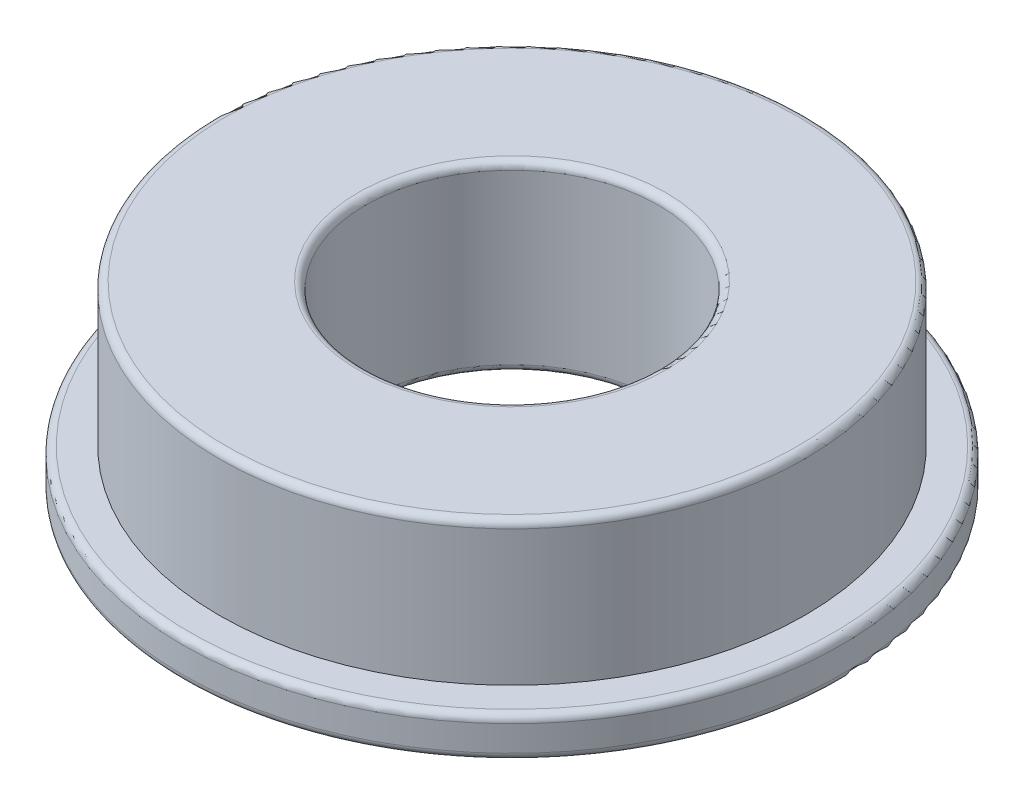
ISO-10303-21;
HEADER;
FILE_DESCRIPTION(('STEP AP214'),'2;1');
FILE_NAME('part.step','',(''),(''),'','','');
FILE_SCHEMA(('AUTOMOTIVE_DESIGN { 1 0 10303 214 1 1 1 1 }'));
ENDSEC;
DATA;
#1=APPLICATION_CONTEXT('core data for automotive mechanical design processes');
#2=APPLICATION_PROTOCOL_DEFINITION('international standard','automotive_design',2000,#1);
#3=PRODUCT_CONTEXT('',#1,'mechanical');
#4=PRODUCT('Part','Part','',(#3));
#5=PRODUCT_RELATED_PRODUCT_CATEGORY('part','',(#4));
#6=PRODUCT_DEFINITION_FORMATION('','',#4);
#7=PRODUCT_DEFINITION_CONTEXT('part definition',#1,'design');
#8=PRODUCT_DEFINITION('design','',#6,#7);
#9=PRODUCT_DEFINITION_SHAPE('','',#8);
#10=(LENGTH_UNIT() NAMED_UNIT(*) SI_UNIT(.MILLI.,.METRE.));
#11=(NAMED_UNIT(*) PLANE_ANGLE_UNIT() SI_UNIT($,.RADIAN.));
#12=(NAMED_UNIT(*) SI_UNIT($,.STERADIAN.) SOLID_ANGLE_UNIT());
#13=UNCERTAINTY_MEASURE_WITH_UNIT(LENGTH_MEASURE(1.E-05),#10,'distance_accuracy_value','');
#14=(GEOMETRIC_REPRESENTATION_CONTEXT(3) GLOBAL_UNCERTAINTY_ASSIGNED_CONTEXT((#13)) GLOBAL_UNIT_ASSIGNED_CONTEXT((#10,
#11,#12)) REPRESENTATION_CONTEXT('',''));
#15=CARTESIAN_POINT('',(0.,0.,0.));
#16=DIRECTION('',(0.,0.,1.));
#17=DIRECTION('',(1.,0.,0.));
#18=AXIS2_PLACEMENT_3D('',#15,#16,#17);
#19=CARTESIAN_POINT('',(0.,5.,0.));
#20=DIRECTION('',(0.,-1.,0.));
#21=DIRECTION('',(0.,0.,-1.));
#22=AXIS2_PLACEMENT_3D('',#19,#20,#21);
#23=CYLINDRICAL_SURFACE('',#22,4.);
#24=CARTESIAN_POINT('',(0.,4.8,0.));
#25=DIRECTION('',(0.,1.,0.));
#26=DIRECTION('',(0.,0.,1.));
#27=AXIS2_PLACEMENT_3D('',#24,#25,#26);
#28=CIRCLE('',#27,4.);
#29=CARTESIAN_POINT('',(0.,4.8,4.));
#30=VERTEX_POINT('',#29);
#31=CARTESIAN_POINT('',(0.,4.8,-4.));
#32=VERTEX_POINT('',#31);
#33=EDGE_CURVE('E11',#30,#32,#28,.T.);
#34=ORIENTED_EDGE('',*,*,#33,.T.);
#35=CARTESIAN_POINT('',(0.,4.8,0.));
#36=DIRECTION('',(0.,1.,0.));
#37=DIRECTION('',(0.,0.,1.));
#38=AXIS2_PLACEMENT_3D('',#35,#36,#37);
#39=CIRCLE('',#38,4.);
#40=EDGE_CURVE('E27',#32,#30,#39,.T.);
#41=ORIENTED_EDGE('',*,*,#40,.T.);
#42=DIRECTION('',(0.,-1.,0.));
#43=VECTOR('',#42,1.);
#44=CARTESIAN_POINT('',(0.,5.,4.));
#45=LINE('',#44,#43);
#46=CARTESIAN_POINT('',(0.,0.2,4.));
#47=VERTEX_POINT('',#46);
#48=EDGE_CURVE('E125',#30,#47,#45,.T.);
#49=ORIENTED_EDGE('',*,*,#48,.T.);
#50=CARTESIAN_POINT('',(0.,0.2,0.));
#51=DIRECTION('',(0.,-1.,0.));
#52=DIRECTION('',(0.,0.,1.));
#53=AXIS2_PLACEMENT_3D('',#50,#51,#52);
#54=CIRCLE('',#53,4.);
#55=CARTESIAN_POINT('',(0.,0.2,-4.));
#56=VERTEX_POINT('',#55);
#57=EDGE_CURVE('E121',#47,#56,#54,.T.);
#58=ORIENTED_EDGE('',*,*,#57,.T.);
#59=CARTESIAN_POINT('',(0.,0.2,0.));
#60=DIRECTION('',(0.,-1.,0.));
#61=DIRECTION('',(0.,0.,1.));
#62=AXIS2_PLACEMENT_3D('',#59,#60,#61);
#63=CIRCLE('',#62,4.);
#64=EDGE_CURVE('E126',#56,#47,#63,.T.);
#65=ORIENTED_EDGE('',*,*,#64,.T.);
#66=ORIENTED_EDGE('',*,*,#48,.F.);
#67=EDGE_LOOP('',(#34,#41,#49,#58,#65,#66));
#68=FACE_BOUND('',#67,.T.);
#69=ADVANCED_FACE('F17',(#68),#23,.F.);
#70=CARTESIAN_POINT('',(0.,0.2,0.));
#71=DIRECTION('',(0.,1.,0.));
#72=DIRECTION('',(0.,0.,1.));
#73=AXIS2_PLACEMENT_3D('',#70,#71,#72);
#74=TOROIDAL_SURFACE('',#73,4.2,0.2);
#75=CARTESIAN_POINT('',(0.,0.,0.));
#76=DIRECTION('',(0.,1.,0.));
#77=DIRECTION('',(0.,0.,1.));
#78=AXIS2_PLACEMENT_3D('',#75,#76,#77);
#79=CIRCLE('',#78,4.2);
#80=CARTESIAN_POINT('',(0.,0.,-4.2));
#81=VERTEX_POINT('',#80);
#82=EDGE_CURVE('E95',#81,#81,#79,.T.);
#83=ORIENTED_EDGE('',*,*,#82,.F.);
#84=CARTESIAN_POINT('',(0.,0.2,-4.2));
#85=DIRECTION('',(-1.,0.,0.));
#86=DIRECTION('',(0.,0.,-1.));
#87=AXIS2_PLACEMENT_3D('',#84,#85,#86);
#88=CIRCLE('',#87,0.2);
#89=EDGE_CURVE('E97',#81,#56,#88,.T.);
#90=ORIENTED_EDGE('',*,*,#89,.T.);
#91=ORIENTED_EDGE('',*,*,#57,.F.);
#92=ORIENTED_EDGE('',*,*,#64,.F.);
#93=ORIENTED_EDGE('',*,*,#89,.F.);
#94=EDGE_LOOP('',(#83,#90,#91,#92,#93));
#95=FACE_BOUND('',#94,.T.);
#96=ADVANCED_FACE('F96',(#95),#74,.T.);
#97=CARTESIAN_POINT('',(0.,4.8,0.));
#98=DIRECTION('',(0.,1.,0.));
#99=DIRECTION('',(0.,0.,1.));
#100=AXIS2_PLACEMENT_3D('',#97,#98,#99);
#101=TOROIDAL_SURFACE('',#100,4.2,0.2);
#102=ORIENTED_EDGE('',*,*,#33,.F.);
#103=ORIENTED_EDGE('',*,*,#40,.F.);
#104=CARTESIAN_POINT('',(0.,4.8,-4.2));
#105=DIRECTION('',(-1.,0.,0.));
#106=DIRECTION('',(0.,0.,-1.));
#107=AXIS2_PLACEMENT_3D('',#104,#105,#106);
#108=CIRCLE('',#107,0.2);
#109=CARTESIAN_POINT('',(0.,5.,-4.2));
#110=VERTEX_POINT('',#109);
#111=EDGE_CURVE('E147',#32,#110,#108,.T.);
#112=ORIENTED_EDGE('',*,*,#111,.T.);
#113=CARTESIAN_POINT('',(0.,5.,0.));
#114=DIRECTION('',(0.,-1.,0.));
#115=DIRECTION('',(0.,0.,1.));
#116=AXIS2_PLACEMENT_3D('',#113,#114,#115);
#117=CIRCLE('',#116,4.2);
#118=EDGE_CURVE('E148',#110,#110,#117,.T.);
#119=ORIENTED_EDGE('',*,*,#118,.F.);
#120=ORIENTED_EDGE('',*,*,#111,.F.);
#121=EDGE_LOOP('',(#102,#103,#112,#119,#120));
#122=FACE_BOUND('',#121,.T.);
#123=ADVANCED_FACE('F176',(#122),#101,.T.);
#124=CARTESIAN_POINT('',(0.,5.,0.));
#125=DIRECTION('',(0.,1.,0.));
#126=DIRECTION('',(1.,0.,0.));
#127=AXIS2_PLACEMENT_3D('',#124,#125,#126);
#128=PLANE('',#127);
#129=CARTESIAN_POINT('',(0.,5.,0.));
#130=DIRECTION('',(0.,1.,0.));
#131=DIRECTION('',(0.,0.,1.));
#132=AXIS2_PLACEMENT_3D('',#129,#130,#131);
#133=CIRCLE('',#132,7.8);
#134=CARTESIAN_POINT('',(0.,5.,-7.8));
#135=VERTEX_POINT('',#134);
#136=EDGE_CURVE('E143',#135,#135,#133,.T.);
#137=ORIENTED_EDGE('',*,*,#136,.T.);
#138=EDGE_LOOP('',(#137));
#139=FACE_BOUND('',#138,.T.);
#140=ORIENTED_EDGE('',*,*,#118,.T.);
#141=EDGE_LOOP('',(#140));
#142=FACE_BOUND('',#141,.T.);
#143=ADVANCED_FACE('F174',(#139,#142),#128,.T.);
#144=CARTESIAN_POINT('',(0.,5.,0.));
#145=DIRECTION('',(0.,-1.,0.));
#146=DIRECTION('',(0.,0.,-1.));
#147=AXIS2_PLACEMENT_3D('',#144,#145,#146);
#148=CYLINDRICAL_SURFACE('',#147,9.);
#149=CARTESIAN_POINT('',(0.,0.2,0.));
#150=DIRECTION('',(0.,1.,0.));
#151=DIRECTION('',(0.,0.,1.));
#152=AXIS2_PLACEMENT_3D('',#149,#150,#151);
#153=CIRCLE('',#152,9.);
#154=CARTESIAN_POINT('',(0.,0.2,9.));
#155=VERTEX_POINT('',#154);
#156=CARTESIAN_POINT('',(0.,0.2,-9.));
#157=VERTEX_POINT('',#156);
#158=EDGE_CURVE('E130',#155,#157,#153,.T.);
#159=ORIENTED_EDGE('',*,*,#158,.T.);
#160=CARTESIAN_POINT('',(0.,0.2,0.));
#161=DIRECTION('',(0.,1.,0.));
#162=DIRECTION('',(0.,0.,1.));
#163=AXIS2_PLACEMENT_3D('',#160,#161,#162);
#164=CIRCLE('',#163,9.);
#165=EDGE_CURVE('E127',#157,#155,#164,.T.);
#166=ORIENTED_EDGE('',*,*,#165,.T.);
#167=DIRECTION('',(0.,1.,0.));
#168=VECTOR('',#167,1.);
#169=CARTESIAN_POINT('',(0.,5.,9.));
#170=LINE('',#169,#168);
#171=CARTESIAN_POINT('',(0.,0.9,9.));
#172=VERTEX_POINT('',#171);
#173=EDGE_CURVE('E20',#155,#172,#170,.T.);
#174=ORIENTED_EDGE('',*,*,#173,.T.);
#175=CARTESIAN_POINT('',(0.,0.9,0.));
#176=DIRECTION('',(0.,-1.,0.));
#177=DIRECTION('',(0.,0.,1.));
#178=AXIS2_PLACEMENT_3D('',#175,#176,#177);
#179=CIRCLE('',#178,9.);
#180=CARTESIAN_POINT('',(0.,0.9,-9.));
#181=VERTEX_POINT('',#180);
#182=EDGE_CURVE('E134',#172,#181,#179,.T.);
#183=ORIENTED_EDGE('',*,*,#182,.T.);
#184=CARTESIAN_POINT('',(0.,0.9,0.));
#185=DIRECTION('',(0.,-1.,0.));
#186=DIRECTION('',(0.,0.,1.));
#187=AXIS2_PLACEMENT_3D('',#184,#185,#186);
#188=CIRCLE('',#187,9.);
#189=EDGE_CURVE('E108',#181,#172,#188,.T.);
#190=ORIENTED_EDGE('',*,*,#189,.T.);
#191=ORIENTED_EDGE('',*,*,#173,.F.);
#192=EDGE_LOOP('',(#159,#166,#174,#183,#190,#191));
#193=FACE_BOUND('',#192,.T.);
#194=ADVANCED_FACE('F199',(#193),#148,.T.);
#195=CARTESIAN_POINT('',(0.,0.,0.));
#196=DIRECTION('',(0.,1.,0.));
#197=DIRECTION('',(1.,0.,0.));
#198=AXIS2_PLACEMENT_3D('',#195,#196,#197);
#199=PLANE('',#198);
#200=CARTESIAN_POINT('',(0.,0.,0.));
#201=DIRECTION('',(0.,-1.,0.));
#202=DIRECTION('',(0.,0.,1.));
#203=AXIS2_PLACEMENT_3D('',#200,#201,#202);
#204=CIRCLE('',#203,8.8);
#205=CARTESIAN_POINT('',(0.,0.,-8.8));
#206=VERTEX_POINT('',#205);
#207=EDGE_CURVE('E100',#206,#206,#204,.T.);
#208=ORIENTED_EDGE('',*,*,#207,.T.);
#209=EDGE_LOOP('',(#208));
#210=FACE_BOUND('',#209,.T.);
#211=ORIENTED_EDGE('',*,*,#82,.T.);
#212=EDGE_LOOP('',(#211));
#213=FACE_BOUND('',#212,.T.);
#214=ADVANCED_FACE('F195',(#210,#213),#199,.F.);
#215=CARTESIAN_POINT('',(0.,1.1,0.));
#216=DIRECTION('',(0.,1.,0.));
#217=DIRECTION('',(1.,0.,0.));
#218=AXIS2_PLACEMENT_3D('',#215,#216,#217);
#219=PLANE('',#218);
#220=CARTESIAN_POINT('',(0.,1.1,0.));
#221=DIRECTION('',(0.,1.,0.));
#222=DIRECTION('',(0.,0.,1.));
#223=AXIS2_PLACEMENT_3D('',#220,#221,#222);
#224=CIRCLE('',#223,8.8);
#225=CARTESIAN_POINT('',(0.,1.1,-8.8));
#226=VERTEX_POINT('',#225);
#227=EDGE_CURVE('E101',#226,#226,#224,.T.);
#228=ORIENTED_EDGE('',*,*,#227,.T.);
#229=EDGE_LOOP('',(#228));
#230=FACE_BOUND('',#229,.T.);
#231=CARTESIAN_POINT('',(0.,1.1,0.));
#232=DIRECTION('',(0.,1.,0.));
#233=DIRECTION('',(0.,0.,1.));
#234=AXIS2_PLACEMENT_3D('',#231,#232,#233);
#235=CIRCLE('',#234,8.);
#236=CARTESIAN_POINT('',(0.,1.1,-8.));
#237=VERTEX_POINT('',#236);
#238=EDGE_CURVE('E139',#237,#237,#235,.T.);
#239=ORIENTED_EDGE('',*,*,#238,.F.);
#240=EDGE_LOOP('',(#239));
#241=FACE_BOUND('',#240,.T.);
#242=ADVANCED_FACE('F198',(#230,#241),#219,.T.);
#243=CARTESIAN_POINT('',(0.,1.1,0.));
#244=DIRECTION('',(0.,1.,0.));
#245=DIRECTION('',(0.,0.,1.));
#246=AXIS2_PLACEMENT_3D('',#243,#244,#245);
#247=CYLINDRICAL_SURFACE('',#246,8.);
#248=CARTESIAN_POINT('',(0.,4.8,0.));
#249=DIRECTION('',(0.,-1.,0.));
#250=DIRECTION('',(0.,0.,1.));
#251=AXIS2_PLACEMENT_3D('',#248,#249,#250);
#252=CIRCLE('',#251,8.);
#253=CARTESIAN_POINT('',(0.,4.8,-8.));
#254=VERTEX_POINT('',#253);
#255=EDGE_CURVE('E112',#254,#254,#252,.T.);
#256=ORIENTED_EDGE('',*,*,#255,.T.);
#257=DIRECTION('',(0.,-1.,0.));
#258=VECTOR('',#257,1.);
#259=CARTESIAN_POINT('',(0.,1.1,-8.));
#260=LINE('',#259,#258);
#261=EDGE_CURVE('E135',#254,#237,#260,.T.);
#262=ORIENTED_EDGE('',*,*,#261,.T.);
#263=ORIENTED_EDGE('',*,*,#238,.T.);
#264=ORIENTED_EDGE('',*,*,#261,.F.);
#265=EDGE_LOOP('',(#256,#262,#263,#264));
#266=FACE_BOUND('',#265,.T.);
#267=ADVANCED_FACE('F206',(#266),#247,.T.);
#268=CARTESIAN_POINT('',(0.,0.2,0.));
#269=DIRECTION('',(0.,1.,0.));
#270=DIRECTION('',(0.,0.,1.));
#271=AXIS2_PLACEMENT_3D('',#268,#269,#270);
#272=TOROIDAL_SURFACE('',#271,8.8,0.2);
#273=ORIENTED_EDGE('',*,*,#158,.F.);
#274=ORIENTED_EDGE('',*,*,#165,.F.);
#275=CARTESIAN_POINT('',(0.,0.2,-8.8));
#276=DIRECTION('',(-1.,0.,0.));
#277=DIRECTION('',(0.,0.,-1.));
#278=AXIS2_PLACEMENT_3D('',#275,#276,#277);
#279=CIRCLE('',#278,0.2);
#280=EDGE_CURVE('E116',#157,#206,#279,.T.);
#281=ORIENTED_EDGE('',*,*,#280,.T.);
#282=ORIENTED_EDGE('',*,*,#207,.F.);
#283=ORIENTED_EDGE('',*,*,#280,.F.);
#284=EDGE_LOOP('',(#273,#274,#281,#282,#283));
#285=FACE_BOUND('',#284,.T.);
#286=ADVANCED_FACE('F193',(#285),#272,.T.);
#287=CARTESIAN_POINT('',(0.,0.9,0.));
#288=DIRECTION('',(0.,1.,0.));
#289=DIRECTION('',(0.,0.,1.));
#290=AXIS2_PLACEMENT_3D('',#287,#288,#289);
#291=TOROIDAL_SURFACE('',#290,8.8,0.2);
#292=ORIENTED_EDGE('',*,*,#227,.F.);
#293=CARTESIAN_POINT('',(0.,0.9,-8.8));
#294=DIRECTION('',(-1.,0.,0.));
#295=DIRECTION('',(0.,0.,-1.));
#296=AXIS2_PLACEMENT_3D('',#293,#294,#295);
#297=CIRCLE('',#296,0.2);
#298=EDGE_CURVE('E117',#226,#181,#297,.T.);
#299=ORIENTED_EDGE('',*,*,#298,.T.);
#300=ORIENTED_EDGE('',*,*,#182,.F.);
#301=ORIENTED_EDGE('',*,*,#189,.F.);
#302=ORIENTED_EDGE('',*,*,#298,.F.);
#303=EDGE_LOOP('',(#292,#299,#300,#301,#302));
#304=FACE_BOUND('',#303,.T.);
#305=ADVANCED_FACE('F189',(#304),#291,.T.);
#306=CARTESIAN_POINT('',(0.,4.8,0.));
#307=DIRECTION('',(0.,1.,0.));
#308=DIRECTION('',(0.,0.,1.));
#309=AXIS2_PLACEMENT_3D('',#306,#307,#308);
#310=TOROIDAL_SURFACE('',#309,7.8,0.2);
#311=ORIENTED_EDGE('',*,*,#136,.F.);
#312=CARTESIAN_POINT('',(0.,4.8,-7.8));
#313=DIRECTION('',(-1.,0.,0.));
#314=DIRECTION('',(0.,0.,-1.));
#315=AXIS2_PLACEMENT_3D('',#312,#313,#314);
#316=CIRCLE('',#315,0.2);
#317=EDGE_CURVE('E120',#135,#254,#316,.T.);
#318=ORIENTED_EDGE('',*,*,#317,.T.);
#319=ORIENTED_EDGE('',*,*,#255,.F.);
#320=ORIENTED_EDGE('',*,*,#317,.F.);
#321=EDGE_LOOP('',(#311,#318,#319,#320));
#322=FACE_BOUND('',#321,.T.);
#323=ADVANCED_FACE('F192',(#322),#310,.T.);
#324=CLOSED_SHELL('',(#69,#96,#123,#143,#194,#214,#242,#267,#286,#305,#323));
#325=MANIFOLD_SOLID_BREP('B1',#324);
#326=ADVANCED_BREP_SHAPE_REPRESENTATION('',(#18,#325),#14);
#327=SHAPE_DEFINITION_REPRESENTATION(#9,#326);
ENDSEC;
END-ISO-10303-21;
